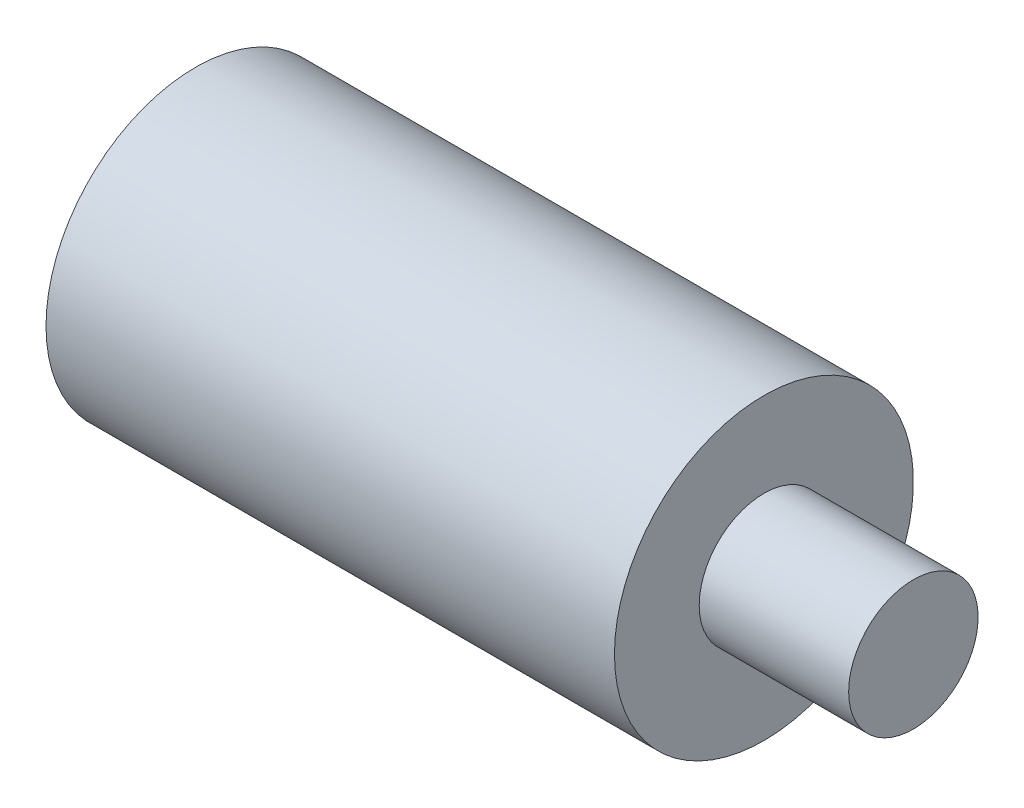
ISO-10303-21;
HEADER;
FILE_DESCRIPTION(('STEP AP214'),'2;1');
FILE_NAME('part.step','',(''),(''),'','','');
FILE_SCHEMA(('AUTOMOTIVE_DESIGN { 1 0 10303 214 1 1 1 1 }'));
ENDSEC;
DATA;
#1=APPLICATION_CONTEXT('core data for automotive mechanical design processes');
#2=APPLICATION_PROTOCOL_DEFINITION('international standard','automotive_design',2000,#1);
#3=PRODUCT_CONTEXT('',#1,'mechanical');
#4=PRODUCT('Part','Part','',(#3));
#5=PRODUCT_RELATED_PRODUCT_CATEGORY('part','',(#4));
#6=PRODUCT_DEFINITION_FORMATION('','',#4);
#7=PRODUCT_DEFINITION_CONTEXT('part definition',#1,'design');
#8=PRODUCT_DEFINITION('design','',#6,#7);
#9=PRODUCT_DEFINITION_SHAPE('','',#8);
#10=(LENGTH_UNIT() NAMED_UNIT(*) SI_UNIT(.MILLI.,.METRE.));
#11=(NAMED_UNIT(*) PLANE_ANGLE_UNIT() SI_UNIT($,.RADIAN.));
#12=(NAMED_UNIT(*) SI_UNIT($,.STERADIAN.) SOLID_ANGLE_UNIT());
#13=UNCERTAINTY_MEASURE_WITH_UNIT(LENGTH_MEASURE(1.E-05),#10,'distance_accuracy_value','');
#14=(GEOMETRIC_REPRESENTATION_CONTEXT(3) GLOBAL_UNCERTAINTY_ASSIGNED_CONTEXT((#13)) GLOBAL_UNIT_ASSIGNED_CONTEXT((#10,
#11,#12)) REPRESENTATION_CONTEXT('',''));
#15=CARTESIAN_POINT('',(0.,0.,0.));
#16=DIRECTION('',(0.,0.,1.));
#17=DIRECTION('',(1.,0.,0.));
#18=AXIS2_PLACEMENT_3D('',#15,#16,#17);
#19=CARTESIAN_POINT('',(12.7,0.,0.));
#20=DIRECTION('',(-1.,0.,0.));
#21=DIRECTION('',(0.,0.,1.));
#22=AXIS2_PLACEMENT_3D('',#19,#20,#21);
#23=PLANE('',#22);
#24=CARTESIAN_POINT('',(12.6999999999999,0.,0.));
#25=DIRECTION('',(-1.,0.,0.));
#26=DIRECTION('',(0.,0.,1.));
#27=AXIS2_PLACEMENT_3D('',#24,#25,#26);
#28=CIRCLE('',#27,5.5);
#29=CARTESIAN_POINT('',(12.6999999999999,0.,5.5));
#30=VERTEX_POINT('',#29);
#31=EDGE_CURVE('E10',#30,#30,#28,.T.);
#32=ORIENTED_EDGE('',*,*,#31,.F.);
#33=EDGE_LOOP('',(#32));
#34=FACE_BOUND('',#33,.T.);
#35=ADVANCED_FACE('F39',(#34),#23,.F.);
#36=CARTESIAN_POINT('',(-1000.,0.,0.));
#37=DIRECTION('',(-1.,0.,0.));
#38=DIRECTION('',(0.,0.,1.));
#39=AXIS2_PLACEMENT_3D('',#36,#37,#38);
#40=CYLINDRICAL_SURFACE('',#39,5.5);
#41=CARTESIAN_POINT('',(0.,0.,0.));
#42=DIRECTION('',(-1.,0.,0.));
#43=DIRECTION('',(0.,0.,1.));
#44=AXIS2_PLACEMENT_3D('',#41,#42,#43);
#45=CIRCLE('',#44,5.5);
#46=CARTESIAN_POINT('',(0.,0.,5.5));
#47=VERTEX_POINT('',#46);
#48=EDGE_CURVE('E46',#47,#47,#45,.T.);
#49=ORIENTED_EDGE('',*,*,#48,.F.);
#50=EDGE_LOOP('',(#49));
#51=FACE_BOUND('',#50,.T.);
#52=ORIENTED_EDGE('',*,*,#31,.T.);
#53=EDGE_LOOP('',(#52));
#54=FACE_BOUND('',#53,.T.);
#55=ADVANCED_FACE('F84',(#51,#54),#40,.T.);
#56=CARTESIAN_POINT('',(0.,5.5,0.));
#57=DIRECTION('',(-1.,0.,0.));
#58=DIRECTION('',(0.,0.,1.));
#59=AXIS2_PLACEMENT_3D('',#56,#57,#58);
#60=PLANE('',#59);
#61=CARTESIAN_POINT('',(0.,0.,0.));
#62=DIRECTION('',(-1.,0.,0.));
#63=DIRECTION('',(0.,0.,1.));
#64=AXIS2_PLACEMENT_3D('',#61,#62,#63);
#65=CIRCLE('',#64,12.7);
#66=CARTESIAN_POINT('',(0.,0.,12.7));
#67=VERTEX_POINT('',#66);
#68=EDGE_CURVE('E49',#67,#67,#65,.T.);
#69=ORIENTED_EDGE('',*,*,#68,.F.);
#70=EDGE_LOOP('',(#69));
#71=FACE_BOUND('',#70,.T.);
#72=ORIENTED_EDGE('',*,*,#48,.T.);
#73=EDGE_LOOP('',(#72));
#74=FACE_BOUND('',#73,.T.);
#75=ADVANCED_FACE('F79',(#71,#74),#60,.F.);
#76=CARTESIAN_POINT('',(-1000.,0.,0.));
#77=DIRECTION('',(-1.,0.,0.));
#78=DIRECTION('',(0.,0.,1.));
#79=AXIS2_PLACEMENT_3D('',#76,#77,#78);
#80=CYLINDRICAL_SURFACE('',#79,12.7);
#81=CARTESIAN_POINT('',(-48.3,0.,0.));
#82=DIRECTION('',(-1.,0.,0.));
#83=DIRECTION('',(0.,0.,1.));
#84=AXIS2_PLACEMENT_3D('',#81,#82,#83);
#85=CIRCLE('',#84,12.7);
#86=CARTESIAN_POINT('',(-48.3,0.,12.7));
#87=VERTEX_POINT('',#86);
#88=EDGE_CURVE('E54',#87,#87,#85,.T.);
#89=ORIENTED_EDGE('',*,*,#88,.F.);
#90=EDGE_LOOP('',(#89));
#91=FACE_BOUND('',#90,.T.);
#92=ORIENTED_EDGE('',*,*,#68,.T.);
#93=EDGE_LOOP('',(#92));
#94=FACE_BOUND('',#93,.T.);
#95=ADVANCED_FACE('F68',(#91,#94),#80,.T.);
#96=CARTESIAN_POINT('',(-48.3,12.7,0.));
#97=DIRECTION('',(1.,0.,0.));
#98=DIRECTION('',(0.,0.,-1.));
#99=AXIS2_PLACEMENT_3D('',#96,#97,#98);
#100=PLANE('',#99);
#101=CARTESIAN_POINT('',(-48.3,0.,0.));
#102=DIRECTION('',(1.,0.,0.));
#103=DIRECTION('',(0.,0.,-1.));
#104=AXIS2_PLACEMENT_3D('',#101,#102,#103);
#105=CIRCLE('',#104,5.5);
#106=CARTESIAN_POINT('',(-48.3,0.,-5.5));
#107=VERTEX_POINT('',#106);
#108=EDGE_CURVE('E45',#107,#107,#105,.F.);
#109=ORIENTED_EDGE('',*,*,#108,.F.);
#110=EDGE_LOOP('',(#109));
#111=FACE_BOUND('',#110,.T.);
#112=ORIENTED_EDGE('',*,*,#88,.T.);
#113=EDGE_LOOP('',(#112));
#114=FACE_BOUND('',#113,.T.);
#115=ADVANCED_FACE('F69',(#111,#114),#100,.F.);
#116=CARTESIAN_POINT('',(-1000.,0.,0.));
#117=DIRECTION('',(-1.,0.,0.));
#118=DIRECTION('',(0.,0.,1.));
#119=AXIS2_PLACEMENT_3D('',#116,#117,#118);
#120=CYLINDRICAL_SURFACE('',#119,5.5);
#121=CARTESIAN_POINT('',(-34.3,0.,0.));
#122=DIRECTION('',(-1.,0.,0.));
#123=DIRECTION('',(0.,0.,1.));
#124=AXIS2_PLACEMENT_3D('',#121,#122,#123);
#125=CIRCLE('',#124,5.5);
#126=CARTESIAN_POINT('',(-34.3,0.,5.5));
#127=VERTEX_POINT('',#126);
#128=EDGE_CURVE('E59',#127,#127,#125,.T.);
#129=ORIENTED_EDGE('',*,*,#128,.F.);
#130=EDGE_LOOP('',(#129));
#131=FACE_BOUND('',#130,.T.);
#132=ORIENTED_EDGE('',*,*,#108,.T.);
#133=EDGE_LOOP('',(#132));
#134=FACE_BOUND('',#133,.T.);
#135=ADVANCED_FACE('F62',(#131,#134),#120,.F.);
#136=CARTESIAN_POINT('',(-34.3,5.5,0.));
#137=DIRECTION('',(-1.,0.,0.));
#138=DIRECTION('',(0.,0.,1.));
#139=AXIS2_PLACEMENT_3D('',#136,#137,#138);
#140=PLANE('',#139);
#141=ORIENTED_EDGE('',*,*,#128,.T.);
#142=EDGE_LOOP('',(#141));
#143=FACE_BOUND('',#142,.T.);
#144=ADVANCED_FACE('F94',(#143),#140,.T.);
#145=CLOSED_SHELL('',(#35,#55,#75,#95,#115,#135,#144));
#146=MANIFOLD_SOLID_BREP('B2',#145);
#147=ADVANCED_BREP_SHAPE_REPRESENTATION('',(#18,#146),#14);
#148=SHAPE_DEFINITION_REPRESENTATION(#9,#147);
ENDSEC;
END-ISO-10303-21;
